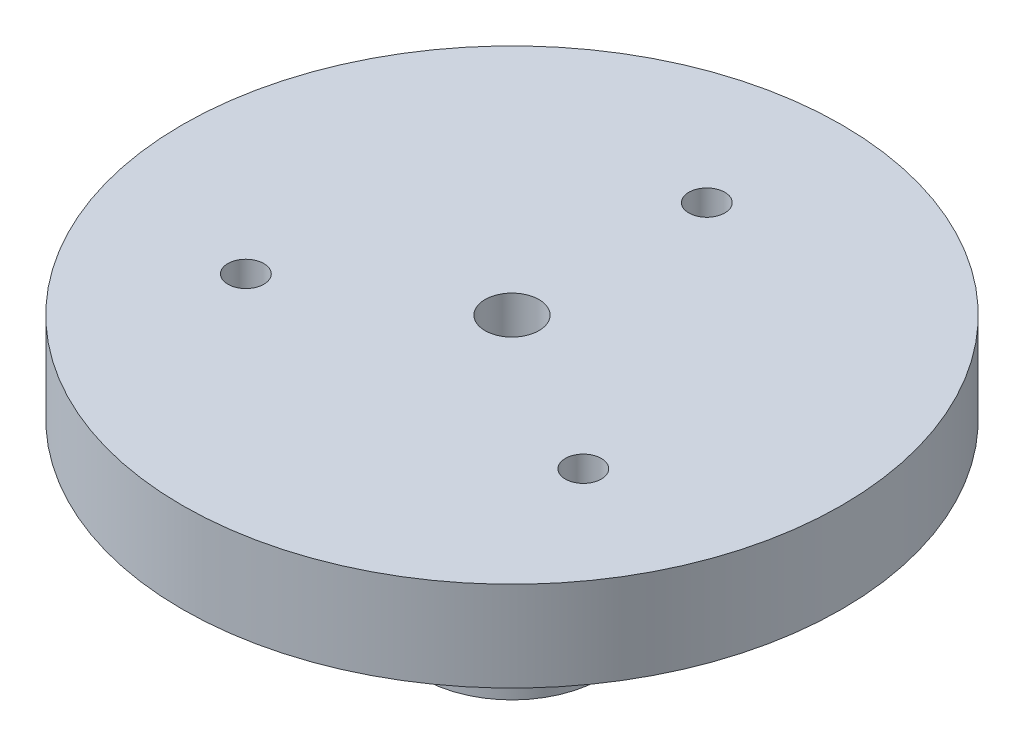
ISO-10303-21;
HEADER;
FILE_DESCRIPTION(('STEP AP214'),'2;1');
FILE_NAME('part.step','',(''),(''),'','','');
FILE_SCHEMA(('AUTOMOTIVE_DESIGN { 1 0 10303 214 1 1 1 1 }'));
ENDSEC;
DATA;
#1=APPLICATION_CONTEXT('core data for automotive mechanical design processes');
#2=APPLICATION_PROTOCOL_DEFINITION('international standard','automotive_design',2000,#1);
#3=PRODUCT_CONTEXT('',#1,'mechanical');
#4=PRODUCT('Part','Part','',(#3));
#5=PRODUCT_RELATED_PRODUCT_CATEGORY('part','',(#4));
#6=PRODUCT_DEFINITION_FORMATION('','',#4);
#7=PRODUCT_DEFINITION_CONTEXT('part definition',#1,'design');
#8=PRODUCT_DEFINITION('design','',#6,#7);
#9=PRODUCT_DEFINITION_SHAPE('','',#8);
#10=(LENGTH_UNIT() NAMED_UNIT(*) SI_UNIT(.MILLI.,.METRE.));
#11=(NAMED_UNIT(*) PLANE_ANGLE_UNIT() SI_UNIT($,.RADIAN.));
#12=(NAMED_UNIT(*) SI_UNIT($,.STERADIAN.) SOLID_ANGLE_UNIT());
#13=UNCERTAINTY_MEASURE_WITH_UNIT(LENGTH_MEASURE(1.E-05),#10,'distance_accuracy_value','');
#14=(GEOMETRIC_REPRESENTATION_CONTEXT(3) GLOBAL_UNCERTAINTY_ASSIGNED_CONTEXT((#13)) GLOBAL_UNIT_ASSIGNED_CONTEXT((#10,
#11,#12)) REPRESENTATION_CONTEXT('',''));
#15=CARTESIAN_POINT('',(0.,0.,0.));
#16=DIRECTION('',(0.,0.,1.));
#17=DIRECTION('',(1.,0.,0.));
#18=AXIS2_PLACEMENT_3D('',#15,#16,#17);
#19=CARTESIAN_POINT('',(0.,-161.,0.));
#20=DIRECTION('',(0.,1.,0.));
#21=DIRECTION('',(0.,0.,1.));
#22=AXIS2_PLACEMENT_3D('',#19,#20,#21);
#23=PLANE('',#22);
#24=CARTESIAN_POINT('',(-5.63,-161.,3.25));
#25=DIRECTION('',(0.,1.,0.));
#26=DIRECTION('',(0.,0.,1.));
#27=AXIS2_PLACEMENT_3D('',#24,#25,#26);
#28=CIRCLE('',#27,0.6);
#29=CARTESIAN_POINT('',(-5.63,-161.,3.85));
#30=VERTEX_POINT('',#29);
#31=EDGE_CURVE('E53',#30,#30,#28,.T.);
#32=ORIENTED_EDGE('',*,*,#31,.F.);
#33=EDGE_LOOP('',(#32));
#34=FACE_BOUND('',#33,.T.);
#35=CARTESIAN_POINT('',(0.,-161.,0.));
#36=DIRECTION('',(0.,1.,0.));
#37=DIRECTION('',(0.,0.,1.));
#38=AXIS2_PLACEMENT_3D('',#35,#36,#37);
#39=CIRCLE('',#38,0.9);
#40=CARTESIAN_POINT('',(0.,-161.,0.9));
#41=VERTEX_POINT('',#40);
#42=EDGE_CURVE('E42',#41,#41,#39,.T.);
#43=ORIENTED_EDGE('',*,*,#42,.F.);
#44=EDGE_LOOP('',(#43));
#45=FACE_BOUND('',#44,.T.);
#46=CARTESIAN_POINT('',(0.,-161.,0.));
#47=DIRECTION('',(0.,1.,0.));
#48=DIRECTION('',(0.,0.,1.));
#49=AXIS2_PLACEMENT_3D('',#46,#47,#48);
#50=CIRCLE('',#49,11.0007230367091);
#51=CARTESIAN_POINT('',(0.,-161.,11.0007230367091));
#52=VERTEX_POINT('',#51);
#53=EDGE_CURVE('E10',#52,#52,#50,.T.);
#54=ORIENTED_EDGE('',*,*,#53,.T.);
#55=EDGE_LOOP('',(#54));
#56=FACE_BOUND('',#55,.T.);
#57=CARTESIAN_POINT('',(0.,-161.,-6.5));
#58=DIRECTION('',(0.,1.,0.));
#59=DIRECTION('',(0.,0.,1.));
#60=AXIS2_PLACEMENT_3D('',#57,#58,#59);
#61=CIRCLE('',#60,0.6);
#62=CARTESIAN_POINT('',(0.,-161.,-5.9));
#63=VERTEX_POINT('',#62);
#64=EDGE_CURVE('E47',#63,#63,#61,.T.);
#65=ORIENTED_EDGE('',*,*,#64,.F.);
#66=EDGE_LOOP('',(#65));
#67=FACE_BOUND('',#66,.T.);
#68=CARTESIAN_POINT('',(5.63,-161.,3.25));
#69=DIRECTION('',(0.,1.,0.));
#70=DIRECTION('',(0.,0.,1.));
#71=AXIS2_PLACEMENT_3D('',#68,#69,#70);
#72=CIRCLE('',#71,0.6);
#73=CARTESIAN_POINT('',(5.63,-161.,3.85));
#74=VERTEX_POINT('',#73);
#75=EDGE_CURVE('E59',#74,#74,#72,.T.);
#76=ORIENTED_EDGE('',*,*,#75,.F.);
#77=EDGE_LOOP('',(#76));
#78=FACE_BOUND('',#77,.T.);
#79=ADVANCED_FACE('F31',(#34,#45,#56,#67,#78),#23,.T.);
#80=CARTESIAN_POINT('',(0.,-164.,0.));
#81=DIRECTION('',(0.,1.,0.));
#82=DIRECTION('',(0.,0.,1.));
#83=AXIS2_PLACEMENT_3D('',#80,#81,#82);
#84=PLANE('',#83);
#85=CARTESIAN_POINT('',(0.,-164.,0.));
#86=DIRECTION('',(0.,-1.,0.));
#87=DIRECTION('',(0.,0.,-1.));
#88=AXIS2_PLACEMENT_3D('',#85,#86,#87);
#89=CIRCLE('',#88,3.);
#90=CARTESIAN_POINT('',(0.,-164.,-3.));
#91=VERTEX_POINT('',#90);
#92=EDGE_CURVE('E65',#91,#91,#89,.T.);
#93=ORIENTED_EDGE('',*,*,#92,.F.);
#94=EDGE_LOOP('',(#93));
#95=FACE_BOUND('',#94,.T.);
#96=CARTESIAN_POINT('',(0.,-164.,0.));
#97=DIRECTION('',(0.,1.,0.));
#98=DIRECTION('',(0.,0.,1.));
#99=AXIS2_PLACEMENT_3D('',#96,#97,#98);
#100=CIRCLE('',#99,11.0007230367091);
#101=CARTESIAN_POINT('',(0.,-164.,11.0007230367091));
#102=VERTEX_POINT('',#101);
#103=EDGE_CURVE('E35',#102,#102,#100,.T.);
#104=ORIENTED_EDGE('',*,*,#103,.F.);
#105=EDGE_LOOP('',(#104));
#106=FACE_BOUND('',#105,.T.);
#107=CARTESIAN_POINT('',(0.,-164.,-6.5));
#108=DIRECTION('',(0.,1.,0.));
#109=DIRECTION('',(0.,0.,1.));
#110=AXIS2_PLACEMENT_3D('',#107,#108,#109);
#111=CIRCLE('',#110,0.6);
#112=CARTESIAN_POINT('',(0.,-164.,-5.9));
#113=VERTEX_POINT('',#112);
#114=EDGE_CURVE('E50',#113,#113,#111,.T.);
#115=ORIENTED_EDGE('',*,*,#114,.T.);
#116=EDGE_LOOP('',(#115));
#117=FACE_BOUND('',#116,.T.);
#118=CARTESIAN_POINT('',(-5.63,-164.,3.25));
#119=DIRECTION('',(0.,1.,0.));
#120=DIRECTION('',(0.,0.,1.));
#121=AXIS2_PLACEMENT_3D('',#118,#119,#120);
#122=CIRCLE('',#121,0.6);
#123=CARTESIAN_POINT('',(-5.63,-164.,3.85));
#124=VERTEX_POINT('',#123);
#125=EDGE_CURVE('E56',#124,#124,#122,.T.);
#126=ORIENTED_EDGE('',*,*,#125,.T.);
#127=EDGE_LOOP('',(#126));
#128=FACE_BOUND('',#127,.T.);
#129=CARTESIAN_POINT('',(5.63,-164.,3.25));
#130=DIRECTION('',(0.,1.,0.));
#131=DIRECTION('',(0.,0.,1.));
#132=AXIS2_PLACEMENT_3D('',#129,#130,#131);
#133=CIRCLE('',#132,0.6);
#134=CARTESIAN_POINT('',(5.63,-164.,3.85));
#135=VERTEX_POINT('',#134);
#136=EDGE_CURVE('E62',#135,#135,#133,.T.);
#137=ORIENTED_EDGE('',*,*,#136,.T.);
#138=EDGE_LOOP('',(#137));
#139=FACE_BOUND('',#138,.T.);
#140=ADVANCED_FACE('F90',(#95,#106,#117,#128,#139),#84,.F.);
#141=CARTESIAN_POINT('',(0.,-161.,0.));
#142=DIRECTION('',(0.,-1.,0.));
#143=DIRECTION('',(0.,0.,-1.));
#144=AXIS2_PLACEMENT_3D('',#141,#142,#143);
#145=CYLINDRICAL_SURFACE('',#144,11.0007230367091);
#146=ORIENTED_EDGE('',*,*,#53,.F.);
#147=EDGE_LOOP('',(#146));
#148=FACE_BOUND('',#147,.T.);
#149=ORIENTED_EDGE('',*,*,#103,.T.);
#150=EDGE_LOOP('',(#149));
#151=FACE_BOUND('',#150,.T.);
#152=ADVANCED_FACE('F33',(#148,#151),#145,.T.);
#153=CARTESIAN_POINT('',(0.,-161.,0.));
#154=DIRECTION('',(0.,-1.,0.));
#155=DIRECTION('',(0.,0.,-1.));
#156=AXIS2_PLACEMENT_3D('',#153,#154,#155);
#157=CYLINDRICAL_SURFACE('',#156,0.9);
#158=ORIENTED_EDGE('',*,*,#42,.T.);
#159=EDGE_LOOP('',(#158));
#160=FACE_BOUND('',#159,.T.);
#161=CARTESIAN_POINT('',(0.,-164.,0.));
#162=DIRECTION('',(0.,1.,0.));
#163=DIRECTION('',(0.,0.,1.));
#164=AXIS2_PLACEMENT_3D('',#161,#162,#163);
#165=CIRCLE('',#164,0.9);
#166=CARTESIAN_POINT('',(0.,-164.,0.9));
#167=VERTEX_POINT('',#166);
#168=EDGE_CURVE('E44',#167,#167,#165,.T.);
#169=ORIENTED_EDGE('',*,*,#168,.F.);
#170=EDGE_LOOP('',(#169));
#171=FACE_BOUND('',#170,.T.);
#172=ADVANCED_FACE('F100',(#160,#171),#157,.F.);
#173=CARTESIAN_POINT('',(0.,-161.,-6.5));
#174=DIRECTION('',(0.,-1.,0.));
#175=DIRECTION('',(0.,0.,-1.));
#176=AXIS2_PLACEMENT_3D('',#173,#174,#175);
#177=CYLINDRICAL_SURFACE('',#176,0.6);
#178=ORIENTED_EDGE('',*,*,#64,.T.);
#179=EDGE_LOOP('',(#178));
#180=FACE_BOUND('',#179,.T.);
#181=ORIENTED_EDGE('',*,*,#114,.F.);
#182=EDGE_LOOP('',(#181));
#183=FACE_BOUND('',#182,.T.);
#184=ADVANCED_FACE('F103',(#180,#183),#177,.F.);
#185=CARTESIAN_POINT('',(-5.63,-161.,3.25));
#186=DIRECTION('',(0.,-1.,0.));
#187=DIRECTION('',(0.,0.,-1.));
#188=AXIS2_PLACEMENT_3D('',#185,#186,#187);
#189=CYLINDRICAL_SURFACE('',#188,0.6);
#190=ORIENTED_EDGE('',*,*,#31,.T.);
#191=EDGE_LOOP('',(#190));
#192=FACE_BOUND('',#191,.T.);
#193=ORIENTED_EDGE('',*,*,#125,.F.);
#194=EDGE_LOOP('',(#193));
#195=FACE_BOUND('',#194,.T.);
#196=ADVANCED_FACE('F107',(#192,#195),#189,.F.);
#197=CARTESIAN_POINT('',(5.63,-161.,3.25));
#198=DIRECTION('',(0.,-1.,0.));
#199=DIRECTION('',(0.,0.,-1.));
#200=AXIS2_PLACEMENT_3D('',#197,#198,#199);
#201=CYLINDRICAL_SURFACE('',#200,0.6);
#202=ORIENTED_EDGE('',*,*,#75,.T.);
#203=EDGE_LOOP('',(#202));
#204=FACE_BOUND('',#203,.T.);
#205=ORIENTED_EDGE('',*,*,#136,.F.);
#206=EDGE_LOOP('',(#205));
#207=FACE_BOUND('',#206,.T.);
#208=ADVANCED_FACE('F86',(#204,#207),#201,.F.);
#209=CARTESIAN_POINT('',(0.,-164.,0.));
#210=DIRECTION('',(0.,1.,0.));
#211=DIRECTION('',(0.,0.,1.));
#212=AXIS2_PLACEMENT_3D('',#209,#210,#211);
#213=PLANE('',#212);
#214=ORIENTED_EDGE('',*,*,#168,.T.);
#215=EDGE_LOOP('',(#214));
#216=FACE_BOUND('',#215,.T.);
#217=ADVANCED_FACE('F78',(#216),#213,.T.);
#218=CARTESIAN_POINT('',(0.,-174.,0.));
#219=DIRECTION('',(0.,-1.,0.));
#220=DIRECTION('',(0.,0.,-1.));
#221=AXIS2_PLACEMENT_3D('',#218,#219,#220);
#222=CYLINDRICAL_SURFACE('',#221,3.);
#223=ORIENTED_EDGE('',*,*,#92,.T.);
#224=EDGE_LOOP('',(#223));
#225=FACE_BOUND('',#224,.T.);
#226=CARTESIAN_POINT('',(0.,-170.,0.));
#227=DIRECTION('',(0.,-1.,0.));
#228=DIRECTION('',(0.,0.,-1.));
#229=AXIS2_PLACEMENT_3D('',#226,#227,#228);
#230=CIRCLE('',#229,3.);
#231=CARTESIAN_POINT('',(0.,-170.,-3.));
#232=VERTEX_POINT('',#231);
#233=EDGE_CURVE('E70',#232,#232,#230,.T.);
#234=ORIENTED_EDGE('',*,*,#233,.F.);
#235=EDGE_LOOP('',(#234));
#236=FACE_BOUND('',#235,.T.);
#237=ADVANCED_FACE('F76',(#225,#236),#222,.T.);
#238=CARTESIAN_POINT('',(1.2,-170.,0.));
#239=DIRECTION('',(0.,-1.,0.));
#240=DIRECTION('',(0.,0.,-1.));
#241=AXIS2_PLACEMENT_3D('',#238,#239,#240);
#242=PLANE('',#241);
#243=ORIENTED_EDGE('',*,*,#233,.T.);
#244=EDGE_LOOP('',(#243));
#245=FACE_BOUND('',#244,.T.);
#246=ADVANCED_FACE('F74',(#245),#242,.T.);
#247=CLOSED_SHELL('',(#79,#140,#152,#172,#184,#196,#208,#217,#237,#246));
#248=MANIFOLD_SOLID_BREP('B2',#247);
#249=ADVANCED_BREP_SHAPE_REPRESENTATION('',(#18,#248),#14);
#250=SHAPE_DEFINITION_REPRESENTATION(#9,#249);
ENDSEC;
END-ISO-10303-21;
